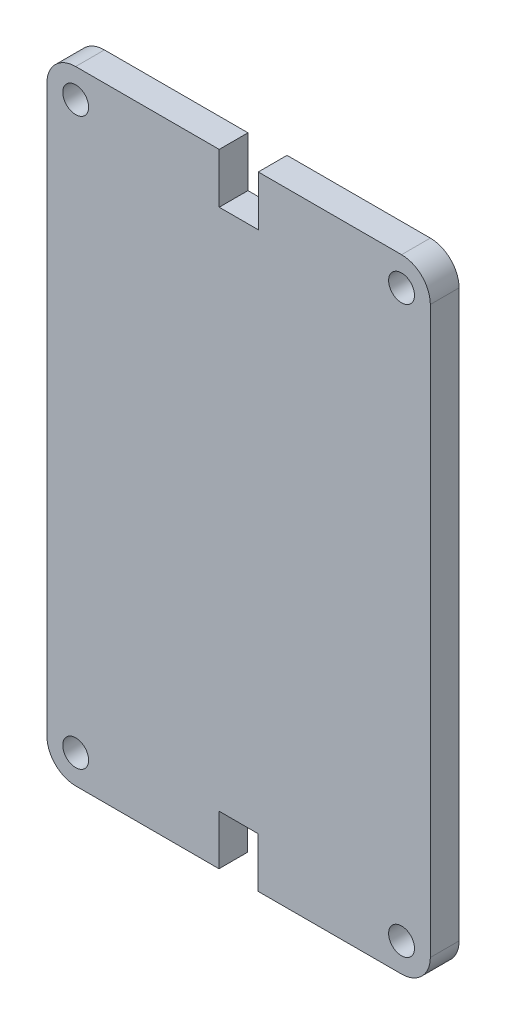
ISO-10303-21;
HEADER;
FILE_DESCRIPTION(('STEP AP214'),'2;1');
FILE_NAME('part.step','',(''),(''),'','','');
FILE_SCHEMA(('AUTOMOTIVE_DESIGN { 1 0 10303 214 1 1 1 1 }'));
ENDSEC;
DATA;
#1=APPLICATION_CONTEXT('core data for automotive mechanical design processes');
#2=APPLICATION_PROTOCOL_DEFINITION('international standard','automotive_design',2000,#1);
#3=PRODUCT_CONTEXT('',#1,'mechanical');
#4=PRODUCT('Part','Part','',(#3));
#5=PRODUCT_RELATED_PRODUCT_CATEGORY('part','',(#4));
#6=PRODUCT_DEFINITION_FORMATION('','',#4);
#7=PRODUCT_DEFINITION_CONTEXT('part definition',#1,'design');
#8=PRODUCT_DEFINITION('design','',#6,#7);
#9=PRODUCT_DEFINITION_SHAPE('','',#8);
#10=(LENGTH_UNIT() NAMED_UNIT(*) SI_UNIT(.MILLI.,.METRE.));
#11=(NAMED_UNIT(*) PLANE_ANGLE_UNIT() SI_UNIT($,.RADIAN.));
#12=(NAMED_UNIT(*) SI_UNIT($,.STERADIAN.) SOLID_ANGLE_UNIT());
#13=UNCERTAINTY_MEASURE_WITH_UNIT(LENGTH_MEASURE(1.E-05),#10,'distance_accuracy_value','');
#14=(GEOMETRIC_REPRESENTATION_CONTEXT(3) GLOBAL_UNCERTAINTY_ASSIGNED_CONTEXT((#13)) GLOBAL_UNIT_ASSIGNED_CONTEXT((#10,
#11,#12)) REPRESENTATION_CONTEXT('',''));
#15=CARTESIAN_POINT('',(0.,0.,0.));
#16=DIRECTION('',(0.,0.,1.));
#17=DIRECTION('',(1.,0.,0.));
#18=AXIS2_PLACEMENT_3D('',#15,#16,#17);
#19=CARTESIAN_POINT('',(0.,62.,3.));
#20=DIRECTION('',(1.,0.,0.));
#21=DIRECTION('',(0.,1.,0.));
#22=AXIS2_PLACEMENT_3D('',#19,#20,#21);
#23=PLANE('',#22);
#24=DIRECTION('',(0.,-1.,0.));
#25=VECTOR('',#24,1.);
#26=CARTESIAN_POINT('',(0.,62.,0.));
#27=LINE('',#26,#25);
#28=CARTESIAN_POINT('',(0.,62.,0.));
#29=VERTEX_POINT('',#28);
#30=CARTESIAN_POINT('',(0.,3.,0.));
#31=VERTEX_POINT('',#30);
#32=EDGE_CURVE('E182',#29,#31,#27,.T.);
#33=ORIENTED_EDGE('',*,*,#32,.T.);
#34=DIRECTION('',(0.,0.,-1.));
#35=VECTOR('',#34,1.);
#36=CARTESIAN_POINT('',(0.,3.,3.));
#37=LINE('',#36,#35);
#38=CARTESIAN_POINT('',(0.,3.,3.));
#39=VERTEX_POINT('',#38);
#40=EDGE_CURVE('E11',#39,#31,#37,.T.);
#41=ORIENTED_EDGE('',*,*,#40,.F.);
#42=DIRECTION('',(0.,-1.,0.));
#43=VECTOR('',#42,1.);
#44=CARTESIAN_POINT('',(0.,62.,3.));
#45=LINE('',#44,#43);
#46=CARTESIAN_POINT('',(0.,62.,3.));
#47=VERTEX_POINT('',#46);
#48=EDGE_CURVE('E213',#47,#39,#45,.T.);
#49=ORIENTED_EDGE('',*,*,#48,.F.);
#50=DIRECTION('',(0.,0.,-1.));
#51=VECTOR('',#50,1.);
#52=CARTESIAN_POINT('',(0.,62.,3.));
#53=LINE('',#52,#51);
#54=EDGE_CURVE('E178',#47,#29,#53,.T.);
#55=ORIENTED_EDGE('',*,*,#54,.T.);
#56=EDGE_LOOP('',(#33,#41,#49,#55));
#57=FACE_BOUND('',#56,.T.);
#58=ADVANCED_FACE('F38',(#57),#23,.F.);
#59=CARTESIAN_POINT('',(3.,3.,3.));
#60=DIRECTION('',(0.,0.,-1.));
#61=DIRECTION('',(-1.,0.,0.));
#62=AXIS2_PLACEMENT_3D('',#59,#60,#61);
#63=CYLINDRICAL_SURFACE('',#62,3.);
#64=CARTESIAN_POINT('',(3.,3.,0.));
#65=DIRECTION('',(0.,0.,1.));
#66=DIRECTION('',(1.,0.,0.));
#67=AXIS2_PLACEMENT_3D('',#64,#65,#66);
#68=CIRCLE('',#67,3.);
#69=CARTESIAN_POINT('',(3.,0.,0.));
#70=VERTEX_POINT('',#69);
#71=EDGE_CURVE('E185',#31,#70,#68,.T.);
#72=ORIENTED_EDGE('',*,*,#71,.T.);
#73=DIRECTION('',(0.,0.,-1.));
#74=VECTOR('',#73,1.);
#75=CARTESIAN_POINT('',(3.,0.,3.));
#76=LINE('',#75,#74);
#77=CARTESIAN_POINT('',(3.,0.,3.));
#78=VERTEX_POINT('',#77);
#79=EDGE_CURVE('E46',#78,#70,#76,.T.);
#80=ORIENTED_EDGE('',*,*,#79,.F.);
#81=CARTESIAN_POINT('',(3.,3.,3.));
#82=DIRECTION('',(0.,0.,1.));
#83=DIRECTION('',(1.,0.,0.));
#84=AXIS2_PLACEMENT_3D('',#81,#82,#83);
#85=CIRCLE('',#84,3.);
#86=EDGE_CURVE('E121',#39,#78,#85,.T.);
#87=ORIENTED_EDGE('',*,*,#86,.F.);
#88=ORIENTED_EDGE('',*,*,#40,.T.);
#89=EDGE_LOOP('',(#72,#80,#87,#88));
#90=FACE_BOUND('',#89,.T.);
#91=ADVANCED_FACE('F312',(#90),#63,.T.);
#92=CARTESIAN_POINT('',(3.,0.,3.));
#93=DIRECTION('',(0.000668896171430121,0.999999776288931,0.));
#94=DIRECTION('',(-0.999999776288931,0.000668896171430121,0.));
#95=AXIS2_PLACEMENT_3D('',#92,#93,#94);
#96=PLANE('',#95);
#97=DIRECTION('',(0.999999776288931,-0.000668896171430121,0.));
#98=VECTOR('',#97,1.);
#99=CARTESIAN_POINT('',(3.,0.,0.));
#100=LINE('',#99,#98);
#101=CARTESIAN_POINT('',(17.95,-0.009999999999991,0.));
#102=VERTEX_POINT('',#101);
#103=EDGE_CURVE('E188',#70,#102,#100,.T.);
#104=ORIENTED_EDGE('',*,*,#103,.T.);
#105=DIRECTION('',(0.,0.,-1.));
#106=VECTOR('',#105,1.);
#107=CARTESIAN_POINT('',(17.95,-0.009999999999991,3.));
#108=LINE('',#107,#106);
#109=CARTESIAN_POINT('',(17.95,-0.009999999999991,3.));
#110=VERTEX_POINT('',#109);
#111=EDGE_CURVE('E244',#110,#102,#108,.T.);
#112=ORIENTED_EDGE('',*,*,#111,.F.);
#113=DIRECTION('',(0.999999776288931,-0.000668896171430121,0.));
#114=VECTOR('',#113,1.);
#115=CARTESIAN_POINT('',(3.,0.,3.));
#116=LINE('',#115,#114);
#117=EDGE_CURVE('E252',#78,#110,#116,.T.);
#118=ORIENTED_EDGE('',*,*,#117,.F.);
#119=ORIENTED_EDGE('',*,*,#79,.T.);
#120=EDGE_LOOP('',(#104,#112,#118,#119));
#121=FACE_BOUND('',#120,.T.);
#122=ADVANCED_FACE('F250',(#121),#96,.F.);
#123=CARTESIAN_POINT('',(17.95,-0.009999999999991,3.));
#124=DIRECTION('',(-1.,0.,0.));
#125=DIRECTION('',(0.,0.,1.));
#126=AXIS2_PLACEMENT_3D('',#123,#124,#125);
#127=PLANE('',#126);
#128=DIRECTION('',(0.,1.,0.));
#129=VECTOR('',#128,1.);
#130=CARTESIAN_POINT('',(17.95,-0.009999999999991,0.));
#131=LINE('',#130,#129);
#132=CARTESIAN_POINT('',(17.95,5.2,0.));
#133=VERTEX_POINT('',#132);
#134=EDGE_CURVE('E190',#102,#133,#131,.T.);
#135=ORIENTED_EDGE('',*,*,#134,.T.);
#136=DIRECTION('',(0.,0.,-1.));
#137=VECTOR('',#136,1.);
#138=CARTESIAN_POINT('',(17.95,5.2,3.));
#139=LINE('',#138,#137);
#140=CARTESIAN_POINT('',(17.95,5.2,3.));
#141=VERTEX_POINT('',#140);
#142=EDGE_CURVE('E241',#141,#133,#139,.T.);
#143=ORIENTED_EDGE('',*,*,#142,.F.);
#144=DIRECTION('',(0.,1.,0.));
#145=VECTOR('',#144,1.);
#146=CARTESIAN_POINT('',(17.95,-0.009999999999991,3.));
#147=LINE('',#146,#145);
#148=EDGE_CURVE('E270',#110,#141,#147,.T.);
#149=ORIENTED_EDGE('',*,*,#148,.F.);
#150=ORIENTED_EDGE('',*,*,#111,.T.);
#151=EDGE_LOOP('',(#135,#143,#149,#150));
#152=FACE_BOUND('',#151,.T.);
#153=ADVANCED_FACE('F261',(#152),#127,.F.);
#154=CARTESIAN_POINT('',(17.95,5.2,3.));
#155=DIRECTION('',(0.,1.,0.));
#156=DIRECTION('',(0.,0.,1.));
#157=AXIS2_PLACEMENT_3D('',#154,#155,#156);
#158=PLANE('',#157);
#159=DIRECTION('',(1.,0.,0.));
#160=VECTOR('',#159,1.);
#161=CARTESIAN_POINT('',(17.95,5.2,0.));
#162=LINE('',#161,#160);
#163=CARTESIAN_POINT('',(22.025,5.2,0.));
#164=VERTEX_POINT('',#163);
#165=EDGE_CURVE('E192',#133,#164,#162,.T.);
#166=ORIENTED_EDGE('',*,*,#165,.T.);
#167=DIRECTION('',(0.,0.,-1.));
#168=VECTOR('',#167,1.);
#169=CARTESIAN_POINT('',(22.025,5.2,3.));
#170=LINE('',#169,#168);
#171=CARTESIAN_POINT('',(22.025,5.2,3.));
#172=VERTEX_POINT('',#171);
#173=EDGE_CURVE('E238',#172,#164,#170,.T.);
#174=ORIENTED_EDGE('',*,*,#173,.F.);
#175=DIRECTION('',(1.,0.,0.));
#176=VECTOR('',#175,1.);
#177=CARTESIAN_POINT('',(17.95,5.2,3.));
#178=LINE('',#177,#176);
#179=EDGE_CURVE('E267',#141,#172,#178,.T.);
#180=ORIENTED_EDGE('',*,*,#179,.F.);
#181=ORIENTED_EDGE('',*,*,#142,.T.);
#182=EDGE_LOOP('',(#166,#174,#180,#181));
#183=FACE_BOUND('',#182,.T.);
#184=ADVANCED_FACE('F265',(#183),#158,.F.);
#185=CARTESIAN_POINT('',(22.025,5.2,3.));
#186=DIRECTION('',(1.,0.,0.));
#187=DIRECTION('',(0.,0.,-1.));
#188=AXIS2_PLACEMENT_3D('',#185,#186,#187);
#189=PLANE('',#188);
#190=DIRECTION('',(0.,-1.,0.));
#191=VECTOR('',#190,1.);
#192=CARTESIAN_POINT('',(22.025,5.2,0.));
#193=LINE('',#192,#191);
#194=CARTESIAN_POINT('',(22.025,-0.009999999999991,0.));
#195=VERTEX_POINT('',#194);
#196=EDGE_CURVE('E194',#164,#195,#193,.T.);
#197=ORIENTED_EDGE('',*,*,#196,.T.);
#198=DIRECTION('',(0.,0.,-1.));
#199=VECTOR('',#198,1.);
#200=CARTESIAN_POINT('',(22.025,-0.009999999999991,3.));
#201=LINE('',#200,#199);
#202=CARTESIAN_POINT('',(22.025,-0.009999999999991,3.));
#203=VERTEX_POINT('',#202);
#204=EDGE_CURVE('E235',#203,#195,#201,.T.);
#205=ORIENTED_EDGE('',*,*,#204,.F.);
#206=DIRECTION('',(0.,-1.,0.));
#207=VECTOR('',#206,1.);
#208=CARTESIAN_POINT('',(22.025,5.2,3.));
#209=LINE('',#208,#207);
#210=EDGE_CURVE('E269',#172,#203,#209,.T.);
#211=ORIENTED_EDGE('',*,*,#210,.F.);
#212=ORIENTED_EDGE('',*,*,#173,.T.);
#213=EDGE_LOOP('',(#197,#205,#211,#212));
#214=FACE_BOUND('',#213,.T.);
#215=ADVANCED_FACE('F325',(#214),#189,.F.);
#216=CARTESIAN_POINT('',(22.025,-0.009999999999991,3.));
#217=DIRECTION('',(-0.000667779483829286,0.999999777035256,0.));
#218=DIRECTION('',(-0.999999777035256,-0.000667779483829286,0.));
#219=AXIS2_PLACEMENT_3D('',#216,#217,#218);
#220=PLANE('',#219);
#221=DIRECTION('',(0.999999777035256,0.000667779483829286,0.));
#222=VECTOR('',#221,1.);
#223=CARTESIAN_POINT('',(22.025,-0.009999999999991,0.));
#224=LINE('',#223,#222);
#225=CARTESIAN_POINT('',(37.,0.,0.));
#226=VERTEX_POINT('',#225);
#227=EDGE_CURVE('E196',#195,#226,#224,.T.);
#228=ORIENTED_EDGE('',*,*,#227,.T.);
#229=DIRECTION('',(0.,0.,-1.));
#230=VECTOR('',#229,1.);
#231=CARTESIAN_POINT('',(37.,0.,3.));
#232=LINE('',#231,#230);
#233=CARTESIAN_POINT('',(37.,0.,3.));
#234=VERTEX_POINT('',#233);
#235=EDGE_CURVE('E232',#234,#226,#232,.T.);
#236=ORIENTED_EDGE('',*,*,#235,.F.);
#237=DIRECTION('',(0.999999777035256,0.000667779483829286,0.));
#238=VECTOR('',#237,1.);
#239=CARTESIAN_POINT('',(22.025,-0.009999999999991,3.));
#240=LINE('',#239,#238);
#241=EDGE_CURVE('E272',#203,#234,#240,.T.);
#242=ORIENTED_EDGE('',*,*,#241,.F.);
#243=ORIENTED_EDGE('',*,*,#204,.T.);
#244=EDGE_LOOP('',(#228,#236,#242,#243));
#245=FACE_BOUND('',#244,.T.);
#246=ADVANCED_FACE('F328',(#245),#220,.F.);
#247=CARTESIAN_POINT('',(37.,3.,3.));
#248=DIRECTION('',(0.,0.,-1.));
#249=DIRECTION('',(-1.,0.,0.));
#250=AXIS2_PLACEMENT_3D('',#247,#248,#249);
#251=CYLINDRICAL_SURFACE('',#250,3.);
#252=CARTESIAN_POINT('',(37.,3.,0.));
#253=DIRECTION('',(0.,0.,1.));
#254=DIRECTION('',(1.,0.,0.));
#255=AXIS2_PLACEMENT_3D('',#252,#253,#254);
#256=CIRCLE('',#255,3.);
#257=CARTESIAN_POINT('',(40.,3.,0.));
#258=VERTEX_POINT('',#257);
#259=EDGE_CURVE('E198',#226,#258,#256,.T.);
#260=ORIENTED_EDGE('',*,*,#259,.T.);
#261=DIRECTION('',(0.,0.,-1.));
#262=VECTOR('',#261,1.);
#263=CARTESIAN_POINT('',(40.,3.,3.));
#264=LINE('',#263,#262);
#265=CARTESIAN_POINT('',(40.,3.,3.));
#266=VERTEX_POINT('',#265);
#267=EDGE_CURVE('E229',#266,#258,#264,.T.);
#268=ORIENTED_EDGE('',*,*,#267,.F.);
#269=CARTESIAN_POINT('',(37.,3.,3.));
#270=DIRECTION('',(0.,0.,1.));
#271=DIRECTION('',(1.,0.,0.));
#272=AXIS2_PLACEMENT_3D('',#269,#270,#271);
#273=CIRCLE('',#272,3.);
#274=EDGE_CURVE('E278',#234,#266,#273,.T.);
#275=ORIENTED_EDGE('',*,*,#274,.F.);
#276=ORIENTED_EDGE('',*,*,#235,.T.);
#277=EDGE_LOOP('',(#260,#268,#275,#276));
#278=FACE_BOUND('',#277,.T.);
#279=ADVANCED_FACE('F332',(#278),#251,.T.);
#280=CARTESIAN_POINT('',(40.,3.,3.));
#281=DIRECTION('',(-1.,0.,0.));
#282=DIRECTION('',(0.,0.,1.));
#283=AXIS2_PLACEMENT_3D('',#280,#281,#282);
#284=PLANE('',#283);
#285=DIRECTION('',(0.,1.,0.));
#286=VECTOR('',#285,1.);
#287=CARTESIAN_POINT('',(40.,3.,0.));
#288=LINE('',#287,#286);
#289=CARTESIAN_POINT('',(40.,62.,0.));
#290=VERTEX_POINT('',#289);
#291=EDGE_CURVE('E200',#258,#290,#288,.T.);
#292=ORIENTED_EDGE('',*,*,#291,.T.);
#293=DIRECTION('',(0.,0.,-1.));
#294=VECTOR('',#293,1.);
#295=CARTESIAN_POINT('',(40.,62.,3.));
#296=LINE('',#295,#294);
#297=CARTESIAN_POINT('',(40.,62.,3.));
#298=VERTEX_POINT('',#297);
#299=EDGE_CURVE('E226',#298,#290,#296,.T.);
#300=ORIENTED_EDGE('',*,*,#299,.F.);
#301=DIRECTION('',(0.,1.,0.));
#302=VECTOR('',#301,1.);
#303=CARTESIAN_POINT('',(40.,3.,3.));
#304=LINE('',#303,#302);
#305=EDGE_CURVE('E280',#266,#298,#304,.T.);
#306=ORIENTED_EDGE('',*,*,#305,.F.);
#307=ORIENTED_EDGE('',*,*,#267,.T.);
#308=EDGE_LOOP('',(#292,#300,#306,#307));
#309=FACE_BOUND('',#308,.T.);
#310=ADVANCED_FACE('F336',(#309),#284,.F.);
#311=CARTESIAN_POINT('',(37.,62.,3.));
#312=DIRECTION('',(0.,0.,-1.));
#313=DIRECTION('',(-1.,0.,0.));
#314=AXIS2_PLACEMENT_3D('',#311,#312,#313);
#315=CYLINDRICAL_SURFACE('',#314,3.);
#316=CARTESIAN_POINT('',(37.,62.,0.));
#317=DIRECTION('',(0.,0.,1.));
#318=DIRECTION('',(1.,0.,0.));
#319=AXIS2_PLACEMENT_3D('',#316,#317,#318);
#320=CIRCLE('',#319,3.);
#321=CARTESIAN_POINT('',(37.,65.,0.));
#322=VERTEX_POINT('',#321);
#323=EDGE_CURVE('E202',#290,#322,#320,.T.);
#324=ORIENTED_EDGE('',*,*,#323,.T.);
#325=DIRECTION('',(0.,0.,-1.));
#326=VECTOR('',#325,1.);
#327=CARTESIAN_POINT('',(37.,65.,3.));
#328=LINE('',#327,#326);
#329=CARTESIAN_POINT('',(37.,65.,3.));
#330=VERTEX_POINT('',#329);
#331=EDGE_CURVE('E223',#330,#322,#328,.T.);
#332=ORIENTED_EDGE('',*,*,#331,.F.);
#333=CARTESIAN_POINT('',(37.,62.,3.));
#334=DIRECTION('',(0.,0.,1.));
#335=DIRECTION('',(1.,0.,0.));
#336=AXIS2_PLACEMENT_3D('',#333,#334,#335);
#337=CIRCLE('',#336,3.);
#338=EDGE_CURVE('E282',#298,#330,#337,.T.);
#339=ORIENTED_EDGE('',*,*,#338,.F.);
#340=ORIENTED_EDGE('',*,*,#299,.T.);
#341=EDGE_LOOP('',(#324,#332,#339,#340));
#342=FACE_BOUND('',#341,.T.);
#343=ADVANCED_FACE('F340',(#342),#315,.T.);
#344=CARTESIAN_POINT('',(37.,65.,3.));
#345=DIRECTION('',(0.,-1.,0.));
#346=DIRECTION('',(0.,0.,-1.));
#347=AXIS2_PLACEMENT_3D('',#344,#345,#346);
#348=PLANE('',#347);
#349=DIRECTION('',(-1.,0.,0.));
#350=VECTOR('',#349,1.);
#351=CARTESIAN_POINT('',(37.,65.,0.));
#352=LINE('',#351,#350);
#353=CARTESIAN_POINT('',(22.05,65.,0.));
#354=VERTEX_POINT('',#353);
#355=EDGE_CURVE('E204',#322,#354,#352,.T.);
#356=ORIENTED_EDGE('',*,*,#355,.T.);
#357=DIRECTION('',(0.,0.,-1.));
#358=VECTOR('',#357,1.);
#359=CARTESIAN_POINT('',(22.05,65.,3.));
#360=LINE('',#359,#358);
#361=CARTESIAN_POINT('',(22.05,65.,3.));
#362=VERTEX_POINT('',#361);
#363=EDGE_CURVE('E220',#362,#354,#360,.T.);
#364=ORIENTED_EDGE('',*,*,#363,.F.);
#365=DIRECTION('',(-1.,0.,0.));
#366=VECTOR('',#365,1.);
#367=CARTESIAN_POINT('',(37.,65.,3.));
#368=LINE('',#367,#366);
#369=EDGE_CURVE('E284',#330,#362,#368,.T.);
#370=ORIENTED_EDGE('',*,*,#369,.F.);
#371=ORIENTED_EDGE('',*,*,#331,.T.);
#372=EDGE_LOOP('',(#356,#364,#370,#371));
#373=FACE_BOUND('',#372,.T.);
#374=ADVANCED_FACE('F344',(#373),#348,.F.);
#375=CARTESIAN_POINT('',(22.05,65.,3.));
#376=DIRECTION('',(1.,0.,0.));
#377=DIRECTION('',(0.,0.,-1.));
#378=AXIS2_PLACEMENT_3D('',#375,#376,#377);
#379=PLANE('',#378);
#380=DIRECTION('',(0.,-1.,0.));
#381=VECTOR('',#380,1.);
#382=CARTESIAN_POINT('',(22.05,65.,0.));
#383=LINE('',#382,#381);
#384=CARTESIAN_POINT('',(22.05,59.775,0.));
#385=VERTEX_POINT('',#384);
#386=EDGE_CURVE('E206',#354,#385,#383,.T.);
#387=ORIENTED_EDGE('',*,*,#386,.T.);
#388=DIRECTION('',(0.,0.,-1.));
#389=VECTOR('',#388,1.);
#390=CARTESIAN_POINT('',(22.05,59.775,3.));
#391=LINE('',#390,#389);
#392=CARTESIAN_POINT('',(22.05,59.775,3.));
#393=VERTEX_POINT('',#392);
#394=EDGE_CURVE('E217',#393,#385,#391,.T.);
#395=ORIENTED_EDGE('',*,*,#394,.F.);
#396=DIRECTION('',(0.,-1.,0.));
#397=VECTOR('',#396,1.);
#398=CARTESIAN_POINT('',(22.05,65.,3.));
#399=LINE('',#398,#397);
#400=EDGE_CURVE('E286',#362,#393,#399,.T.);
#401=ORIENTED_EDGE('',*,*,#400,.F.);
#402=ORIENTED_EDGE('',*,*,#363,.T.);
#403=EDGE_LOOP('',(#387,#395,#401,#402));
#404=FACE_BOUND('',#403,.T.);
#405=ADVANCED_FACE('F292',(#404),#379,.F.);
#406=CARTESIAN_POINT('',(22.05,59.775,3.));
#407=DIRECTION('',(0.,-1.,0.));
#408=DIRECTION('',(0.,0.,-1.));
#409=AXIS2_PLACEMENT_3D('',#406,#407,#408);
#410=PLANE('',#409);
#411=DIRECTION('',(-1.,0.,0.));
#412=VECTOR('',#411,1.);
#413=CARTESIAN_POINT('',(22.05,59.775,0.));
#414=LINE('',#413,#412);
#415=CARTESIAN_POINT('',(17.975,59.775,0.));
#416=VERTEX_POINT('',#415);
#417=EDGE_CURVE('E208',#385,#416,#414,.T.);
#418=ORIENTED_EDGE('',*,*,#417,.T.);
#419=DIRECTION('',(0.,0.,-1.));
#420=VECTOR('',#419,1.);
#421=CARTESIAN_POINT('',(17.975,59.775,3.));
#422=LINE('',#421,#420);
#423=CARTESIAN_POINT('',(17.975,59.775,3.));
#424=VERTEX_POINT('',#423);
#425=EDGE_CURVE('E173',#424,#416,#422,.T.);
#426=ORIENTED_EDGE('',*,*,#425,.F.);
#427=DIRECTION('',(-1.,0.,0.));
#428=VECTOR('',#427,1.);
#429=CARTESIAN_POINT('',(22.05,59.775,3.));
#430=LINE('',#429,#428);
#431=EDGE_CURVE('E164',#393,#424,#430,.T.);
#432=ORIENTED_EDGE('',*,*,#431,.F.);
#433=ORIENTED_EDGE('',*,*,#394,.T.);
#434=EDGE_LOOP('',(#418,#426,#432,#433));
#435=FACE_BOUND('',#434,.T.);
#436=ADVANCED_FACE('F296',(#435),#410,.F.);
#437=CARTESIAN_POINT('',(17.975,59.775,3.));
#438=DIRECTION('',(-1.,0.,0.));
#439=DIRECTION('',(0.,0.,1.));
#440=AXIS2_PLACEMENT_3D('',#437,#438,#439);
#441=PLANE('',#440);
#442=DIRECTION('',(0.,1.,0.));
#443=VECTOR('',#442,1.);
#444=CARTESIAN_POINT('',(17.975,59.775,0.));
#445=LINE('',#444,#443);
#446=CARTESIAN_POINT('',(17.975,65.,0.));
#447=VERTEX_POINT('',#446);
#448=EDGE_CURVE('E172',#416,#447,#445,.T.);
#449=ORIENTED_EDGE('',*,*,#448,.T.);
#450=DIRECTION('',(0.,0.,-1.));
#451=VECTOR('',#450,1.);
#452=CARTESIAN_POINT('',(17.975,65.,3.));
#453=LINE('',#452,#451);
#454=CARTESIAN_POINT('',(17.975,65.,3.));
#455=VERTEX_POINT('',#454);
#456=EDGE_CURVE('E169',#455,#447,#453,.T.);
#457=ORIENTED_EDGE('',*,*,#456,.F.);
#458=DIRECTION('',(0.,1.,0.));
#459=VECTOR('',#458,1.);
#460=CARTESIAN_POINT('',(17.975,59.775,3.));
#461=LINE('',#460,#459);
#462=EDGE_CURVE('E158',#424,#455,#461,.T.);
#463=ORIENTED_EDGE('',*,*,#462,.F.);
#464=ORIENTED_EDGE('',*,*,#425,.T.);
#465=EDGE_LOOP('',(#449,#457,#463,#464));
#466=FACE_BOUND('',#465,.T.);
#467=ADVANCED_FACE('F170',(#466),#441,.F.);
#468=CARTESIAN_POINT('',(17.975,65.,3.));
#469=DIRECTION('',(0.,-1.,0.));
#470=DIRECTION('',(0.,0.,-1.));
#471=AXIS2_PLACEMENT_3D('',#468,#469,#470);
#472=PLANE('',#471);
#473=DIRECTION('',(-1.,0.,0.));
#474=VECTOR('',#473,1.);
#475=CARTESIAN_POINT('',(17.975,65.,0.));
#476=LINE('',#475,#474);
#477=CARTESIAN_POINT('',(3.,65.,0.));
#478=VERTEX_POINT('',#477);
#479=EDGE_CURVE('E107',#447,#478,#476,.T.);
#480=ORIENTED_EDGE('',*,*,#479,.T.);
#481=DIRECTION('',(0.,0.,-1.));
#482=VECTOR('',#481,1.);
#483=CARTESIAN_POINT('',(3.,65.,3.));
#484=LINE('',#483,#482);
#485=CARTESIAN_POINT('',(3.,65.,3.));
#486=VERTEX_POINT('',#485);
#487=EDGE_CURVE('E174',#486,#478,#484,.T.);
#488=ORIENTED_EDGE('',*,*,#487,.F.);
#489=DIRECTION('',(-1.,0.,0.));
#490=VECTOR('',#489,1.);
#491=CARTESIAN_POINT('',(17.975,65.,3.));
#492=LINE('',#491,#490);
#493=EDGE_CURVE('E162',#455,#486,#492,.T.);
#494=ORIENTED_EDGE('',*,*,#493,.F.);
#495=ORIENTED_EDGE('',*,*,#456,.T.);
#496=EDGE_LOOP('',(#480,#488,#494,#495));
#497=FACE_BOUND('',#496,.T.);
#498=ADVANCED_FACE('F176',(#497),#472,.F.);
#499=CARTESIAN_POINT('',(3.,62.,3.));
#500=DIRECTION('',(0.,0.,-1.));
#501=DIRECTION('',(-1.,0.,0.));
#502=AXIS2_PLACEMENT_3D('',#499,#500,#501);
#503=CYLINDRICAL_SURFACE('',#502,3.);
#504=CARTESIAN_POINT('',(3.,62.,0.));
#505=DIRECTION('',(0.,0.,1.));
#506=DIRECTION('',(1.,0.,0.));
#507=AXIS2_PLACEMENT_3D('',#504,#505,#506);
#508=CIRCLE('',#507,3.);
#509=EDGE_CURVE('E113',#478,#29,#508,.T.);
#510=ORIENTED_EDGE('',*,*,#509,.T.);
#511=ORIENTED_EDGE('',*,*,#54,.F.);
#512=CARTESIAN_POINT('',(3.,62.,3.));
#513=DIRECTION('',(0.,0.,1.));
#514=DIRECTION('',(1.,0.,0.));
#515=AXIS2_PLACEMENT_3D('',#512,#513,#514);
#516=CIRCLE('',#515,3.);
#517=EDGE_CURVE('E54',#486,#47,#516,.T.);
#518=ORIENTED_EDGE('',*,*,#517,.F.);
#519=ORIENTED_EDGE('',*,*,#487,.T.);
#520=EDGE_LOOP('',(#510,#511,#518,#519));
#521=FACE_BOUND('',#520,.T.);
#522=ADVANCED_FACE('F300',(#521),#503,.T.);
#523=CARTESIAN_POINT('',(3.,3.,3.));
#524=DIRECTION('',(0.,0.,1.));
#525=DIRECTION('',(1.,0.,0.));
#526=AXIS2_PLACEMENT_3D('',#523,#524,#525);
#527=PLANE('',#526);
#528=CARTESIAN_POINT('',(3.,62.,3.));
#529=DIRECTION('',(0.,0.,1.));
#530=DIRECTION('',(1.,0.,0.));
#531=AXIS2_PLACEMENT_3D('',#528,#529,#530);
#532=CIRCLE('',#531,1.35);
#533=CARTESIAN_POINT('',(4.35,62.,3.));
#534=VERTEX_POINT('',#533);
#535=EDGE_CURVE('E430',#534,#534,#532,.T.);
#536=ORIENTED_EDGE('',*,*,#535,.F.);
#537=EDGE_LOOP('',(#536));
#538=FACE_BOUND('',#537,.T.);
#539=CARTESIAN_POINT('',(37.,62.,3.));
#540=DIRECTION('',(0.,0.,1.));
#541=DIRECTION('',(1.,0.,0.));
#542=AXIS2_PLACEMENT_3D('',#539,#540,#541);
#543=CIRCLE('',#542,1.35000000000001);
#544=CARTESIAN_POINT('',(38.35,62.,3.));
#545=VERTEX_POINT('',#544);
#546=EDGE_CURVE('E432',#545,#545,#543,.T.);
#547=ORIENTED_EDGE('',*,*,#546,.F.);
#548=EDGE_LOOP('',(#547));
#549=FACE_BOUND('',#548,.T.);
#550=CARTESIAN_POINT('',(37.,3.,3.));
#551=DIRECTION('',(0.,0.,1.));
#552=DIRECTION('',(1.,0.,0.));
#553=AXIS2_PLACEMENT_3D('',#550,#551,#552);
#554=CIRCLE('',#553,1.35000000000001);
#555=CARTESIAN_POINT('',(38.35,3.,3.));
#556=VERTEX_POINT('',#555);
#557=EDGE_CURVE('E446',#556,#556,#554,.T.);
#558=ORIENTED_EDGE('',*,*,#557,.F.);
#559=EDGE_LOOP('',(#558));
#560=FACE_BOUND('',#559,.T.);
#561=CARTESIAN_POINT('',(3.,3.,3.));
#562=DIRECTION('',(0.,0.,1.));
#563=DIRECTION('',(1.,0.,0.));
#564=AXIS2_PLACEMENT_3D('',#561,#562,#563);
#565=CIRCLE('',#564,1.35);
#566=CARTESIAN_POINT('',(4.35,3.,3.));
#567=VERTEX_POINT('',#566);
#568=EDGE_CURVE('E438',#567,#567,#565,.T.);
#569=ORIENTED_EDGE('',*,*,#568,.F.);
#570=EDGE_LOOP('',(#569));
#571=FACE_BOUND('',#570,.T.);
#572=ORIENTED_EDGE('',*,*,#48,.T.);
#573=ORIENTED_EDGE('',*,*,#86,.T.);
#574=ORIENTED_EDGE('',*,*,#117,.T.);
#575=ORIENTED_EDGE('',*,*,#148,.T.);
#576=ORIENTED_EDGE('',*,*,#179,.T.);
#577=ORIENTED_EDGE('',*,*,#210,.T.);
#578=ORIENTED_EDGE('',*,*,#241,.T.);
#579=ORIENTED_EDGE('',*,*,#274,.T.);
#580=ORIENTED_EDGE('',*,*,#305,.T.);
#581=ORIENTED_EDGE('',*,*,#338,.T.);
#582=ORIENTED_EDGE('',*,*,#369,.T.);
#583=ORIENTED_EDGE('',*,*,#400,.T.);
#584=ORIENTED_EDGE('',*,*,#431,.T.);
#585=ORIENTED_EDGE('',*,*,#462,.T.);
#586=ORIENTED_EDGE('',*,*,#493,.T.);
#587=ORIENTED_EDGE('',*,*,#517,.T.);
#588=EDGE_LOOP('',(#572,#573,#574,#575,#576,#577,#578,#579,#580,#581,#582,#583,#584,#585,#586,#587));
#589=FACE_BOUND('',#588,.T.);
#590=ADVANCED_FACE('F160',(#538,#549,#560,#571,#589),#527,.T.);
#591=CARTESIAN_POINT('',(3.,3.,0.));
#592=DIRECTION('',(0.,0.,1.));
#593=DIRECTION('',(1.,0.,0.));
#594=AXIS2_PLACEMENT_3D('',#591,#592,#593);
#595=PLANE('',#594);
#596=CARTESIAN_POINT('',(3.,62.,0.));
#597=DIRECTION('',(0.,0.,1.));
#598=DIRECTION('',(1.,0.,0.));
#599=AXIS2_PLACEMENT_3D('',#596,#597,#598);
#600=CIRCLE('',#599,1.35);
#601=CARTESIAN_POINT('',(4.35,62.,0.));
#602=VERTEX_POINT('',#601);
#603=EDGE_CURVE('E427',#602,#602,#600,.T.);
#604=ORIENTED_EDGE('',*,*,#603,.T.);
#605=EDGE_LOOP('',(#604));
#606=FACE_BOUND('',#605,.T.);
#607=CARTESIAN_POINT('',(37.,62.,0.));
#608=DIRECTION('',(0.,0.,1.));
#609=DIRECTION('',(1.,0.,0.));
#610=AXIS2_PLACEMENT_3D('',#607,#608,#609);
#611=CIRCLE('',#610,1.35000000000001);
#612=CARTESIAN_POINT('',(38.35,62.,0.));
#613=VERTEX_POINT('',#612);
#614=EDGE_CURVE('E451',#613,#613,#611,.T.);
#615=ORIENTED_EDGE('',*,*,#614,.T.);
#616=EDGE_LOOP('',(#615));
#617=FACE_BOUND('',#616,.T.);
#618=CARTESIAN_POINT('',(37.,3.,0.));
#619=DIRECTION('',(0.,0.,1.));
#620=DIRECTION('',(1.,0.,0.));
#621=AXIS2_PLACEMENT_3D('',#618,#619,#620);
#622=CIRCLE('',#621,1.35000000000001);
#623=CARTESIAN_POINT('',(38.35,3.,0.));
#624=VERTEX_POINT('',#623);
#625=EDGE_CURVE('E441',#624,#624,#622,.T.);
#626=ORIENTED_EDGE('',*,*,#625,.T.);
#627=EDGE_LOOP('',(#626));
#628=FACE_BOUND('',#627,.T.);
#629=CARTESIAN_POINT('',(3.,3.,0.));
#630=DIRECTION('',(0.,0.,1.));
#631=DIRECTION('',(1.,0.,0.));
#632=AXIS2_PLACEMENT_3D('',#629,#630,#631);
#633=CIRCLE('',#632,1.35);
#634=CARTESIAN_POINT('',(4.35,3.,0.));
#635=VERTEX_POINT('',#634);
#636=EDGE_CURVE('E186',#635,#635,#633,.T.);
#637=ORIENTED_EDGE('',*,*,#636,.T.);
#638=EDGE_LOOP('',(#637));
#639=FACE_BOUND('',#638,.T.);
#640=ORIENTED_EDGE('',*,*,#32,.F.);
#641=ORIENTED_EDGE('',*,*,#509,.F.);
#642=ORIENTED_EDGE('',*,*,#479,.F.);
#643=ORIENTED_EDGE('',*,*,#448,.F.);
#644=ORIENTED_EDGE('',*,*,#417,.F.);
#645=ORIENTED_EDGE('',*,*,#386,.F.);
#646=ORIENTED_EDGE('',*,*,#355,.F.);
#647=ORIENTED_EDGE('',*,*,#323,.F.);
#648=ORIENTED_EDGE('',*,*,#291,.F.);
#649=ORIENTED_EDGE('',*,*,#259,.F.);
#650=ORIENTED_EDGE('',*,*,#227,.F.);
#651=ORIENTED_EDGE('',*,*,#196,.F.);
#652=ORIENTED_EDGE('',*,*,#165,.F.);
#653=ORIENTED_EDGE('',*,*,#134,.F.);
#654=ORIENTED_EDGE('',*,*,#103,.F.);
#655=ORIENTED_EDGE('',*,*,#71,.F.);
#656=EDGE_LOOP('',(#640,#641,#642,#643,#644,#645,#646,#647,#648,#649,#650,#651,#652,#653,#654,#655));
#657=FACE_BOUND('',#656,.T.);
#658=ADVANCED_FACE('F256',(#606,#617,#628,#639,#657),#595,.F.);
#659=CARTESIAN_POINT('',(3.,3.,0.));
#660=DIRECTION('',(0.,0.,1.));
#661=DIRECTION('',(1.,0.,0.));
#662=AXIS2_PLACEMENT_3D('',#659,#660,#661);
#663=CYLINDRICAL_SURFACE('',#662,1.35);
#664=ORIENTED_EDGE('',*,*,#636,.F.);
#665=EDGE_LOOP('',(#664));
#666=FACE_BOUND('',#665,.T.);
#667=ORIENTED_EDGE('',*,*,#568,.T.);
#668=EDGE_LOOP('',(#667));
#669=FACE_BOUND('',#668,.T.);
#670=ADVANCED_FACE('F381',(#666,#669),#663,.F.);
#671=CARTESIAN_POINT('',(37.,3.,0.));
#672=DIRECTION('',(0.,0.,1.));
#673=DIRECTION('',(1.,0.,0.));
#674=AXIS2_PLACEMENT_3D('',#671,#672,#673);
#675=CYLINDRICAL_SURFACE('',#674,1.35000000000001);
#676=ORIENTED_EDGE('',*,*,#625,.F.);
#677=EDGE_LOOP('',(#676));
#678=FACE_BOUND('',#677,.T.);
#679=ORIENTED_EDGE('',*,*,#557,.T.);
#680=EDGE_LOOP('',(#679));
#681=FACE_BOUND('',#680,.T.);
#682=ADVANCED_FACE('F390',(#678,#681),#675,.F.);
#683=CARTESIAN_POINT('',(37.,62.,0.));
#684=DIRECTION('',(0.,0.,1.));
#685=DIRECTION('',(1.,0.,0.));
#686=AXIS2_PLACEMENT_3D('',#683,#684,#685);
#687=CYLINDRICAL_SURFACE('',#686,1.35000000000001);
#688=ORIENTED_EDGE('',*,*,#614,.F.);
#689=EDGE_LOOP('',(#688));
#690=FACE_BOUND('',#689,.T.);
#691=ORIENTED_EDGE('',*,*,#546,.T.);
#692=EDGE_LOOP('',(#691));
#693=FACE_BOUND('',#692,.T.);
#694=ADVANCED_FACE('F400',(#690,#693),#687,.F.);
#695=CARTESIAN_POINT('',(3.,62.,0.));
#696=DIRECTION('',(0.,0.,1.));
#697=DIRECTION('',(1.,0.,0.));
#698=AXIS2_PLACEMENT_3D('',#695,#696,#697);
#699=CYLINDRICAL_SURFACE('',#698,1.35);
#700=ORIENTED_EDGE('',*,*,#603,.F.);
#701=EDGE_LOOP('',(#700));
#702=FACE_BOUND('',#701,.T.);
#703=ORIENTED_EDGE('',*,*,#535,.T.);
#704=EDGE_LOOP('',(#703));
#705=FACE_BOUND('',#704,.T.);
#706=ADVANCED_FACE('F410',(#702,#705),#699,.F.);
#707=CLOSED_SHELL('',(#58,#91,#122,#153,#184,#215,#246,#279,#310,#343,#374,#405,#436,#467,#498,
#522,#590,#658,#670,#682,#694,#706));
#708=MANIFOLD_SOLID_BREP('B2',#707);
#709=ADVANCED_BREP_SHAPE_REPRESENTATION('',(#18,#708),#14);
#710=SHAPE_DEFINITION_REPRESENTATION(#9,#709);
ENDSEC;
END-ISO-10303-21;
